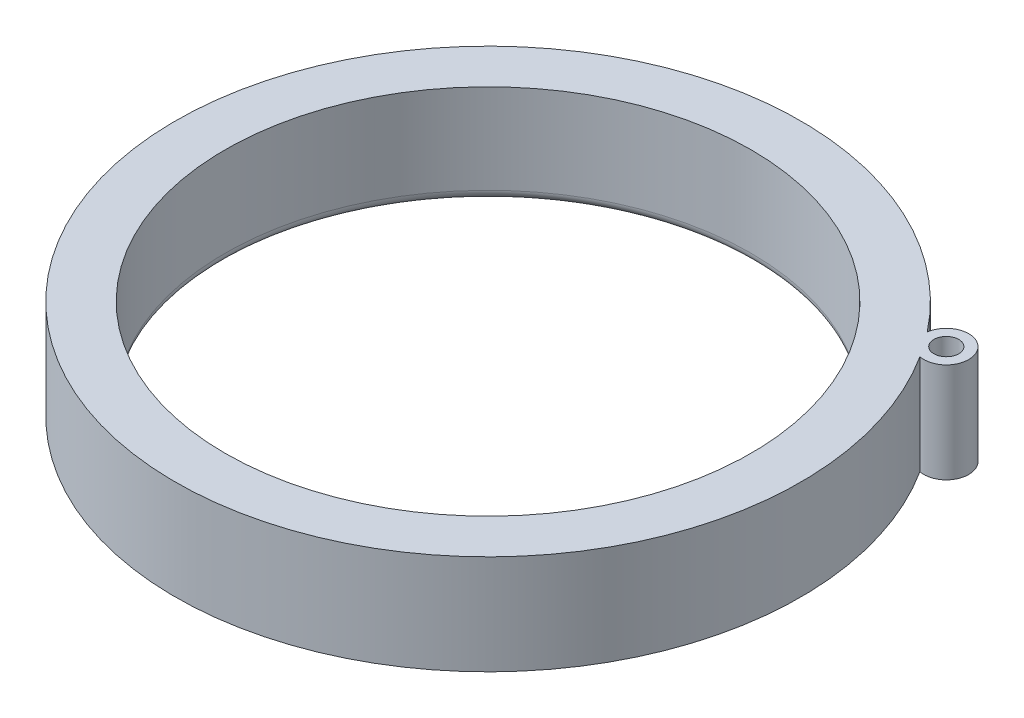
ISO-10303-21;
HEADER;
FILE_DESCRIPTION(('STEP AP214'),'2;1');
FILE_NAME('part.step','',(''),(''),'','','');
FILE_SCHEMA(('AUTOMOTIVE_DESIGN { 1 0 10303 214 1 1 1 1 }'));
ENDSEC;
DATA;
#1=APPLICATION_CONTEXT('core data for automotive mechanical design processes');
#2=APPLICATION_PROTOCOL_DEFINITION('international standard','automotive_design',2000,#1);
#3=PRODUCT_CONTEXT('',#1,'mechanical');
#4=PRODUCT('Part','Part','',(#3));
#5=PRODUCT_RELATED_PRODUCT_CATEGORY('part','',(#4));
#6=PRODUCT_DEFINITION_FORMATION('','',#4);
#7=PRODUCT_DEFINITION_CONTEXT('part definition',#1,'design');
#8=PRODUCT_DEFINITION('design','',#6,#7);
#9=PRODUCT_DEFINITION_SHAPE('','',#8);
#10=(LENGTH_UNIT() NAMED_UNIT(*) SI_UNIT(.MILLI.,.METRE.));
#11=(NAMED_UNIT(*) PLANE_ANGLE_UNIT() SI_UNIT($,.RADIAN.));
#12=(NAMED_UNIT(*) SI_UNIT($,.STERADIAN.) SOLID_ANGLE_UNIT());
#13=UNCERTAINTY_MEASURE_WITH_UNIT(LENGTH_MEASURE(1.E-05),#10,'distance_accuracy_value','');
#14=(GEOMETRIC_REPRESENTATION_CONTEXT(3) GLOBAL_UNCERTAINTY_ASSIGNED_CONTEXT((#13)) GLOBAL_UNIT_ASSIGNED_CONTEXT((#10,
#11,#12)) REPRESENTATION_CONTEXT('',''));
#15=CARTESIAN_POINT('',(0.,0.,0.));
#16=DIRECTION('',(0.,0.,1.));
#17=DIRECTION('',(1.,0.,0.));
#18=AXIS2_PLACEMENT_3D('',#15,#16,#17);
#19=CARTESIAN_POINT('',(13.4624013689996,10.,-9.54011265027612));
#20=DIRECTION('',(0.,1.,0.));
#21=DIRECTION('',(0.,0.,1.));
#22=AXIS2_PLACEMENT_3D('',#19,#20,#21);
#23=PLANE('',#22);
#24=CARTESIAN_POINT('',(0.,10.,0.));
#25=DIRECTION('',(0.,1.,0.));
#26=DIRECTION('',(0.,0.,1.));
#27=AXIS2_PLACEMENT_3D('',#24,#25,#26);
#28=CIRCLE('',#27,26.4);
#29=CARTESIAN_POINT('',(0.,10.,26.4));
#30=VERTEX_POINT('',#29);
#31=EDGE_CURVE('E83',#30,#30,#28,.T.);
#32=ORIENTED_EDGE('',*,*,#31,.F.);
#33=EDGE_LOOP('',(#32));
#34=FACE_BOUND('',#33,.T.);
#35=CARTESIAN_POINT('',(26.9248027379992,10.,-19.0802253005522));
#36=DIRECTION('',(0.,1.,0.));
#37=DIRECTION('',(0.,0.,1.));
#38=AXIS2_PLACEMENT_3D('',#35,#36,#37);
#39=CIRCLE('',#38,2.25);
#40=CARTESIAN_POINT('',(26.480356642727,10.,-16.8745581297404));
#41=VERTEX_POINT('',#40);
#42=CARTESIAN_POINT('',(24.6964862180422,10.,-19.3918428335744));
#43=VERTEX_POINT('',#42);
#44=EDGE_CURVE('E75',#41,#43,#39,.T.);
#45=ORIENTED_EDGE('',*,*,#44,.T.);
#46=CARTESIAN_POINT('',(0.,10.,0.));
#47=DIRECTION('',(0.,1.,0.));
#48=DIRECTION('',(0.,0.,1.));
#49=AXIS2_PLACEMENT_3D('',#46,#47,#48);
#50=CIRCLE('',#49,31.4);
#51=EDGE_CURVE('E57',#43,#41,#50,.T.);
#52=ORIENTED_EDGE('',*,*,#51,.T.);
#53=EDGE_LOOP('',(#45,#52));
#54=FACE_BOUND('',#53,.T.);
#55=CARTESIAN_POINT('',(26.9248027379992,10.,-19.0802253005522));
#56=DIRECTION('',(0.,1.,0.));
#57=DIRECTION('',(0.,0.,1.));
#58=AXIS2_PLACEMENT_3D('',#55,#56,#57);
#59=CIRCLE('',#58,1.25);
#60=CARTESIAN_POINT('',(26.9248027379992,10.,-17.8302253005522));
#61=VERTEX_POINT('',#60);
#62=EDGE_CURVE('E86',#61,#61,#59,.T.);
#63=ORIENTED_EDGE('',*,*,#62,.F.);
#64=EDGE_LOOP('',(#63));
#65=FACE_BOUND('',#64,.T.);
#66=ADVANCED_FACE('F41',(#34,#54,#65),#23,.T.);
#67=CARTESIAN_POINT('',(13.4624013689996,0.,-9.54011265027612));
#68=DIRECTION('',(0.,1.,0.));
#69=DIRECTION('',(0.,0.,1.));
#70=AXIS2_PLACEMENT_3D('',#67,#68,#69);
#71=PLANE('',#70);
#72=CARTESIAN_POINT('',(0.,0.,0.));
#73=DIRECTION('',(0.,1.,0.));
#74=DIRECTION('',(0.,0.,1.));
#75=AXIS2_PLACEMENT_3D('',#72,#73,#74);
#76=CIRCLE('',#75,27.4);
#77=CARTESIAN_POINT('',(0.,0.,27.4));
#78=VERTEX_POINT('',#77);
#79=EDGE_CURVE('E50',#78,#78,#76,.T.);
#80=ORIENTED_EDGE('',*,*,#79,.T.);
#81=EDGE_LOOP('',(#80));
#82=FACE_BOUND('',#81,.T.);
#83=CARTESIAN_POINT('',(26.9248027379992,0.,-19.0802253005522));
#84=DIRECTION('',(0.,1.,0.));
#85=DIRECTION('',(0.,0.,1.));
#86=AXIS2_PLACEMENT_3D('',#83,#84,#85);
#87=CIRCLE('',#86,2.25);
#88=CARTESIAN_POINT('',(26.480356642727,0.,-16.8745581297404));
#89=VERTEX_POINT('',#88);
#90=CARTESIAN_POINT('',(24.6964862180422,0.,-19.3918428335744));
#91=VERTEX_POINT('',#90);
#92=EDGE_CURVE('E76',#89,#91,#87,.T.);
#93=ORIENTED_EDGE('',*,*,#92,.F.);
#94=CARTESIAN_POINT('',(0.,0.,0.));
#95=DIRECTION('',(0.,1.,0.));
#96=DIRECTION('',(0.,0.,1.));
#97=AXIS2_PLACEMENT_3D('',#94,#95,#96);
#98=CIRCLE('',#97,31.4);
#99=EDGE_CURVE('E65',#91,#89,#98,.T.);
#100=ORIENTED_EDGE('',*,*,#99,.F.);
#101=EDGE_LOOP('',(#93,#100));
#102=FACE_BOUND('',#101,.T.);
#103=CARTESIAN_POINT('',(26.9248027379992,0.,-19.0802253005522));
#104=DIRECTION('',(0.,1.,0.));
#105=DIRECTION('',(0.,0.,1.));
#106=AXIS2_PLACEMENT_3D('',#103,#104,#105);
#107=CIRCLE('',#106,1.25);
#108=CARTESIAN_POINT('',(26.9248027379992,0.,-17.8302253005522));
#109=VERTEX_POINT('',#108);
#110=EDGE_CURVE('E161',#109,#109,#107,.T.);
#111=ORIENTED_EDGE('',*,*,#110,.T.);
#112=EDGE_LOOP('',(#111));
#113=FACE_BOUND('',#112,.T.);
#114=ADVANCED_FACE('F81',(#82,#102,#113),#71,.F.);
#115=CARTESIAN_POINT('',(26.9248027379992,10.,-19.0802253005522));
#116=DIRECTION('',(0.,-1.,0.));
#117=DIRECTION('',(0.,0.,-1.));
#118=AXIS2_PLACEMENT_3D('',#115,#116,#117);
#119=CYLINDRICAL_SURFACE('',#118,2.25);
#120=ORIENTED_EDGE('',*,*,#92,.T.);
#121=DIRECTION('',(0.,-1.,0.));
#122=VECTOR('',#121,1.);
#123=CARTESIAN_POINT('',(24.6964862180422,10.,-19.3918428335744));
#124=LINE('',#123,#122);
#125=EDGE_CURVE('E73',#43,#91,#124,.T.);
#126=ORIENTED_EDGE('',*,*,#125,.F.);
#127=ORIENTED_EDGE('',*,*,#44,.F.);
#128=DIRECTION('',(0.,-1.,0.));
#129=VECTOR('',#128,1.);
#130=CARTESIAN_POINT('',(26.480356642727,10.,-16.8745581297404));
#131=LINE('',#130,#129);
#132=EDGE_CURVE('E70',#41,#89,#131,.T.);
#133=ORIENTED_EDGE('',*,*,#132,.T.);
#134=EDGE_LOOP('',(#120,#126,#127,#133));
#135=FACE_BOUND('',#134,.T.);
#136=ADVANCED_FACE('F79',(#135),#119,.T.);
#137=CARTESIAN_POINT('',(0.,10.,0.));
#138=DIRECTION('',(0.,-1.,0.));
#139=DIRECTION('',(0.,0.,-1.));
#140=AXIS2_PLACEMENT_3D('',#137,#138,#139);
#141=CYLINDRICAL_SURFACE('',#140,31.4);
#142=ORIENTED_EDGE('',*,*,#99,.T.);
#143=ORIENTED_EDGE('',*,*,#132,.F.);
#144=ORIENTED_EDGE('',*,*,#51,.F.);
#145=ORIENTED_EDGE('',*,*,#125,.T.);
#146=EDGE_LOOP('',(#142,#143,#144,#145));
#147=FACE_BOUND('',#146,.T.);
#148=ADVANCED_FACE('F69',(#147),#141,.T.);
#149=CARTESIAN_POINT('',(0.,10.,0.));
#150=DIRECTION('',(0.,-1.,0.));
#151=DIRECTION('',(0.,0.,-1.));
#152=AXIS2_PLACEMENT_3D('',#149,#150,#151);
#153=CYLINDRICAL_SURFACE('',#152,26.4);
#154=CARTESIAN_POINT('',(0.,0.999999999999999,0.));
#155=DIRECTION('',(0.,1.,0.));
#156=DIRECTION('',(0.,0.,1.));
#157=AXIS2_PLACEMENT_3D('',#154,#155,#156);
#158=CIRCLE('',#157,26.4);
#159=CARTESIAN_POINT('',(0.,0.999999999999999,26.4));
#160=VERTEX_POINT('',#159);
#161=EDGE_CURVE('E11',#160,#160,#158,.F.);
#162=ORIENTED_EDGE('',*,*,#161,.T.);
#163=EDGE_LOOP('',(#162));
#164=FACE_BOUND('',#163,.T.);
#165=ORIENTED_EDGE('',*,*,#31,.T.);
#166=EDGE_LOOP('',(#165));
#167=FACE_BOUND('',#166,.T.);
#168=ADVANCED_FACE('F102',(#164,#167),#153,.F.);
#169=CARTESIAN_POINT('',(26.9248027379992,10.,-19.0802253005522));
#170=DIRECTION('',(0.,-1.,0.));
#171=DIRECTION('',(0.,0.,-1.));
#172=AXIS2_PLACEMENT_3D('',#169,#170,#171);
#173=CYLINDRICAL_SURFACE('',#172,1.25);
#174=ORIENTED_EDGE('',*,*,#62,.T.);
#175=EDGE_LOOP('',(#174));
#176=FACE_BOUND('',#175,.T.);
#177=ORIENTED_EDGE('',*,*,#110,.F.);
#178=EDGE_LOOP('',(#177));
#179=FACE_BOUND('',#178,.T.);
#180=ADVANCED_FACE('F96',(#176,#179),#173,.F.);
#181=CARTESIAN_POINT('',(0.,0.999999999999999,0.));
#182=DIRECTION('',(0.,1.,0.));
#183=DIRECTION('',(0.,0.,1.));
#184=AXIS2_PLACEMENT_3D('',#181,#182,#183);
#185=TOROIDAL_SURFACE('',#184,27.4,1.);
#186=ORIENTED_EDGE('',*,*,#161,.F.);
#187=EDGE_LOOP('',(#186));
#188=FACE_BOUND('',#187,.T.);
#189=ORIENTED_EDGE('',*,*,#79,.F.);
#190=EDGE_LOOP('',(#189));
#191=FACE_BOUND('',#190,.T.);
#192=ADVANCED_FACE('F43',(#188,#191),#185,.T.);
#193=CLOSED_SHELL('',(#66,#114,#136,#148,#168,#180,#192));
#194=MANIFOLD_SOLID_BREP('B2',#193);
#195=ADVANCED_BREP_SHAPE_REPRESENTATION('',(#18,#194),#14);
#196=SHAPE_DEFINITION_REPRESENTATION(#9,#195);
ENDSEC;
END-ISO-10303-21;
